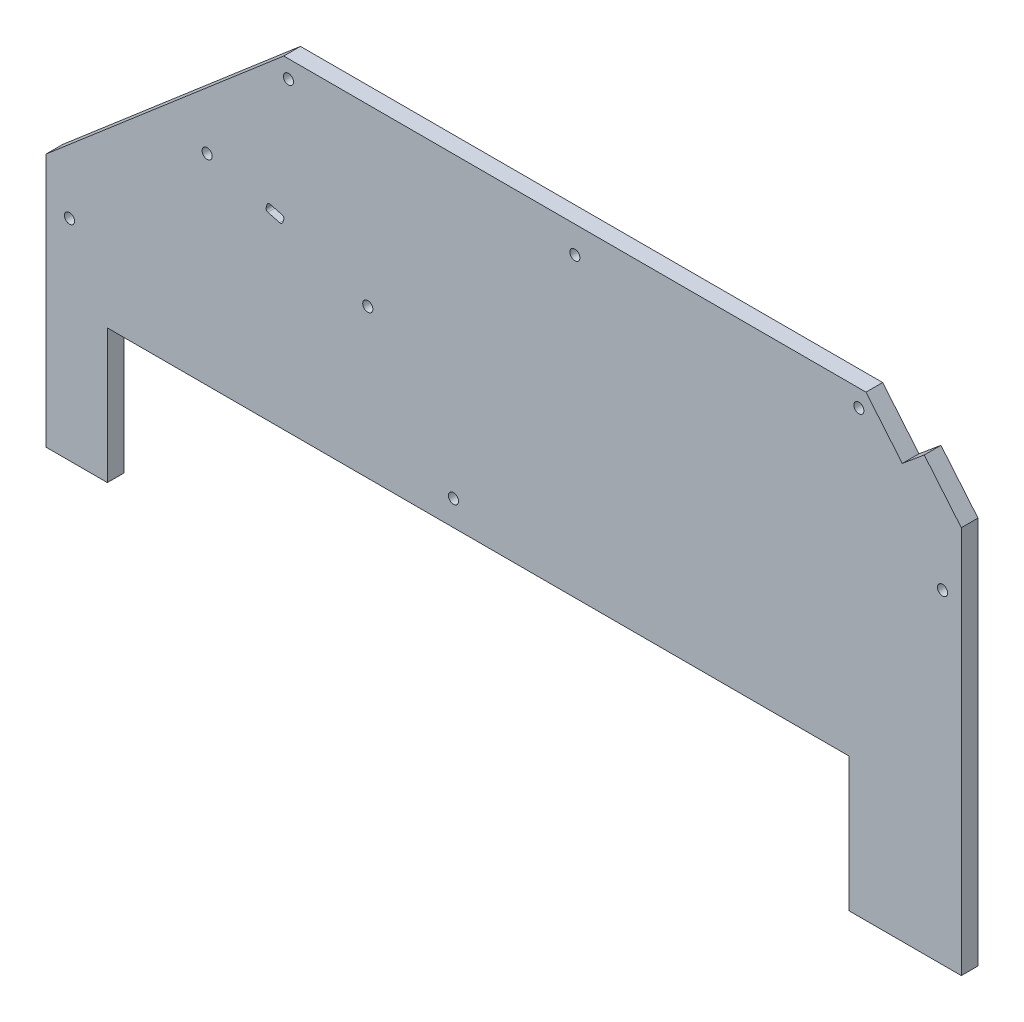
ISO-10303-21;
HEADER;
FILE_DESCRIPTION(('STEP AP214'),'2;1');
FILE_NAME('part.step','',(''),(''),'','','');
FILE_SCHEMA(('AUTOMOTIVE_DESIGN { 1 0 10303 214 1 1 1 1 }'));
ENDSEC;
DATA;
#1=APPLICATION_CONTEXT('core data for automotive mechanical design processes');
#2=APPLICATION_PROTOCOL_DEFINITION('international standard','automotive_design',2000,#1);
#3=PRODUCT_CONTEXT('',#1,'mechanical');
#4=PRODUCT('Part','Part','',(#3));
#5=PRODUCT_RELATED_PRODUCT_CATEGORY('part','',(#4));
#6=PRODUCT_DEFINITION_FORMATION('','',#4);
#7=PRODUCT_DEFINITION_CONTEXT('part definition',#1,'design');
#8=PRODUCT_DEFINITION('design','',#6,#7);
#9=PRODUCT_DEFINITION_SHAPE('','',#8);
#10=(LENGTH_UNIT() NAMED_UNIT(*) SI_UNIT(.MILLI.,.METRE.));
#11=(NAMED_UNIT(*) PLANE_ANGLE_UNIT() SI_UNIT($,.RADIAN.));
#12=(NAMED_UNIT(*) SI_UNIT($,.STERADIAN.) SOLID_ANGLE_UNIT());
#13=UNCERTAINTY_MEASURE_WITH_UNIT(LENGTH_MEASURE(1.E-05),#10,'distance_accuracy_value','');
#14=(GEOMETRIC_REPRESENTATION_CONTEXT(3) GLOBAL_UNCERTAINTY_ASSIGNED_CONTEXT((#13)) GLOBAL_UNIT_ASSIGNED_CONTEXT((#10,
#11,#12)) REPRESENTATION_CONTEXT('',''));
#15=CARTESIAN_POINT('',(0.,0.,0.));
#16=DIRECTION('',(0.,0.,1.));
#17=DIRECTION('',(1.,0.,0.));
#18=AXIS2_PLACEMENT_3D('',#15,#16,#17);
#19=CARTESIAN_POINT('',(2.27248775352962E-13,216.1,11.1125));
#20=DIRECTION('',(-0.768221279597372,-0.640184399664484,0.));
#21=DIRECTION('',(0.640184399664484,-0.768221279597372,0.));
#22=AXIS2_PLACEMENT_3D('',#19,#20,#21);
#23=PLANE('',#22);
#24=DIRECTION('',(0.,0.,1.));
#25=VECTOR('',#24,1.);
#26=CARTESIAN_POINT('',(-39.3145231764971,263.277427811796,0.));
#27=LINE('',#26,#25);
#28=CARTESIAN_POINT('',(-39.3145231764971,263.277427811796,0.));
#29=VERTEX_POINT('',#28);
#30=CARTESIAN_POINT('',(-39.3145231764971,263.277427811796,11.1125));
#31=VERTEX_POINT('',#30);
#32=EDGE_CURVE('E54',#29,#31,#27,.T.);
#33=ORIENTED_EDGE('',*,*,#32,.F.);
#34=DIRECTION('',(-0.640184399664484,0.768221279597372,0.));
#35=VECTOR('',#34,1.);
#36=CARTESIAN_POINT('',(2.27248775352962E-13,216.1,0.));
#37=LINE('',#36,#35);
#38=CARTESIAN_POINT('',(-63.4999999999995,292.299999999999,0.));
#39=VERTEX_POINT('',#38);
#40=EDGE_CURVE('E188',#29,#39,#37,.T.);
#41=ORIENTED_EDGE('',*,*,#40,.T.);
#42=DIRECTION('',(0.,0.,-1.));
#43=VECTOR('',#42,1.);
#44=CARTESIAN_POINT('',(-63.4999999999995,292.299999999999,11.1125));
#45=LINE('',#44,#43);
#46=CARTESIAN_POINT('',(-63.4999999999995,292.299999999999,11.1125));
#47=VERTEX_POINT('',#46);
#48=EDGE_CURVE('E357',#47,#39,#45,.T.);
#49=ORIENTED_EDGE('',*,*,#48,.F.);
#50=DIRECTION('',(-0.640184399664484,0.768221279597372,0.));
#51=VECTOR('',#50,1.);
#52=CARTESIAN_POINT('',(2.27248775352962E-13,216.1,11.1125));
#53=LINE('',#52,#51);
#54=EDGE_CURVE('E334',#31,#47,#53,.T.);
#55=ORIENTED_EDGE('',*,*,#54,.F.);
#56=EDGE_LOOP('',(#33,#41,#49,#55));
#57=FACE_BOUND('',#56,.T.);
#58=ADVANCED_FACE('F37',(#57),#23,.F.);
#59=CARTESIAN_POINT('',(0.,0.,11.1125));
#60=DIRECTION('',(0.,0.,1.));
#61=DIRECTION('',(1.,0.,0.));
#62=AXIS2_PLACEMENT_3D('',#59,#60,#61);
#63=PLANE('',#62);
#64=DIRECTION('',(0.,1.,0.));
#65=VECTOR('',#64,1.);
#66=CARTESIAN_POINT('',(-609.6,-12.5000000000001,11.1125));
#67=LINE('',#66,#65);
#68=CARTESIAN_POINT('',(-609.6,-12.5000000000001,11.1125));
#69=VERTEX_POINT('',#68);
#70=CARTESIAN_POINT('',(-609.6,156.571428571429,11.1125));
#71=VERTEX_POINT('',#70);
#72=EDGE_CURVE('E62',#69,#71,#67,.T.);
#73=ORIENTED_EDGE('',*,*,#72,.F.);
#74=DIRECTION('',(1.,0.,0.));
#75=VECTOR('',#74,1.);
#76=CARTESIAN_POINT('',(-629.05,-12.4999999999999,11.1125));
#77=LINE('',#76,#75);
#78=CARTESIAN_POINT('',(-568.725000000001,-12.4999999999999,11.1125));
#79=VERTEX_POINT('',#78);
#80=EDGE_CURVE('E321',#69,#79,#77,.T.);
#81=ORIENTED_EDGE('',*,*,#80,.T.);
#82=DIRECTION('',(0.,1.,0.));
#83=VECTOR('',#82,1.);
#84=CARTESIAN_POINT('',(-568.725000000001,-12.4999999999999,11.1125));
#85=LINE('',#84,#83);
#86=CARTESIAN_POINT('',(-568.725000000001,76.7620000000009,11.1125));
#87=VERTEX_POINT('',#86);
#88=EDGE_CURVE('E323',#79,#87,#85,.T.);
#89=ORIENTED_EDGE('',*,*,#88,.T.);
#90=DIRECTION('',(1.,0.,0.));
#91=VECTOR('',#90,1.);
#92=CARTESIAN_POINT('',(-568.725000000001,76.7620000000009,11.1125));
#93=LINE('',#92,#91);
#94=CARTESIAN_POINT('',(-74.8137000039997,76.7620000000009,11.1125));
#95=VERTEX_POINT('',#94);
#96=EDGE_CURVE('E326',#87,#95,#93,.T.);
#97=ORIENTED_EDGE('',*,*,#96,.T.);
#98=DIRECTION('',(0.,-1.,0.));
#99=VECTOR('',#98,1.);
#100=CARTESIAN_POINT('',(-74.8137000039997,-12.5,11.1125));
#101=LINE('',#100,#99);
#102=CARTESIAN_POINT('',(-74.8137000039997,-12.5,11.1125));
#103=VERTEX_POINT('',#102);
#104=EDGE_CURVE('E328',#95,#103,#101,.T.);
#105=ORIENTED_EDGE('',*,*,#104,.T.);
#106=DIRECTION('',(1.,0.,0.));
#107=VECTOR('',#106,1.);
#108=CARTESIAN_POINT('',(0.,-12.5,11.1125));
#109=LINE('',#108,#107);
#110=CARTESIAN_POINT('',(0.,-12.5,11.1125));
#111=VERTEX_POINT('',#110);
#112=EDGE_CURVE('E330',#103,#111,#109,.T.);
#113=ORIENTED_EDGE('',*,*,#112,.T.);
#114=DIRECTION('',(0.,1.,0.));
#115=VECTOR('',#114,1.);
#116=CARTESIAN_POINT('',(0.,-12.5,11.1125));
#117=LINE('',#116,#115);
#118=CARTESIAN_POINT('',(0.,245.857051265204,11.1125));
#119=VERTEX_POINT('',#118);
#120=EDGE_CURVE('E332',#111,#119,#117,.T.);
#121=ORIENTED_EDGE('',*,*,#120,.T.);
#122=DIRECTION('',(-0.640184399664486,0.768221279597371,0.));
#123=VECTOR('',#122,1.);
#124=CARTESIAN_POINT('',(0.,245.857051265204,11.1125));
#125=LINE('',#124,#123);
#126=CARTESIAN_POINT('',(-24.6799078001674,275.472940625405,11.1125));
#127=VERTEX_POINT('',#126);
#128=EDGE_CURVE('E197',#119,#127,#125,.T.);
#129=ORIENTED_EDGE('',*,*,#128,.T.);
#130=DIRECTION('',(-0.76822127959737,-0.640184399664487,0.));
#131=VECTOR('',#130,1.);
#132=CARTESIAN_POINT('',(-24.6799078001674,275.472940625405,11.1125));
#133=LINE('',#132,#131);
#134=EDGE_CURVE('E205',#127,#31,#133,.T.);
#135=ORIENTED_EDGE('',*,*,#134,.T.);
#136=ORIENTED_EDGE('',*,*,#54,.T.);
#137=DIRECTION('',(-1.,0.,0.));
#138=VECTOR('',#137,1.);
#139=CARTESIAN_POINT('',(-63.4999999999995,292.299999999999,11.1125));
#140=LINE('',#139,#138);
#141=CARTESIAN_POINT('',(-451.25,292.3,11.1125));
#142=VERTEX_POINT('',#141);
#143=EDGE_CURVE('E336',#47,#142,#140,.T.);
#144=ORIENTED_EDGE('',*,*,#143,.T.);
#145=DIRECTION('',(-0.759256602365297,-0.650791373455969,0.));
#146=VECTOR('',#145,1.);
#147=CARTESIAN_POINT('',(-451.25,292.3,11.1125));
#148=LINE('',#147,#146);
#149=EDGE_CURVE('E338',#142,#71,#148,.T.);
#150=ORIENTED_EDGE('',*,*,#149,.T.);
#151=EDGE_LOOP('',(#73,#81,#89,#97,#105,#113,#121,#129,#135,#136,#144,#150));
#152=FACE_BOUND('',#151,.T.);
#153=CARTESIAN_POINT('',(-502.262125610698,210.539469688394,11.1125));
#154=DIRECTION('',(0.,0.,1.));
#155=DIRECTION('',(1.,0.,0.));
#156=AXIS2_PLACEMENT_3D('',#153,#154,#155);
#157=CIRCLE('',#156,3.37819999999999);
#158=CARTESIAN_POINT('',(-498.883925610698,210.539469688394,11.1125));
#159=VERTEX_POINT('',#158);
#160=EDGE_CURVE('E237',#159,#159,#157,.T.);
#161=ORIENTED_EDGE('',*,*,#160,.F.);
#162=EDGE_LOOP('',(#161));
#163=FACE_BOUND('',#162,.T.);
#164=CARTESIAN_POINT('',(-338.209654284305,93.617887803001,11.1125));
#165=DIRECTION('',(0.,0.,1.));
#166=DIRECTION('',(1.,0.,0.));
#167=AXIS2_PLACEMENT_3D('',#164,#165,#166);
#168=CIRCLE('',#167,3.3782);
#169=CARTESIAN_POINT('',(-334.831454284305,93.617887803001,11.1125));
#170=VERTEX_POINT('',#169);
#171=EDGE_CURVE('E234',#170,#170,#168,.T.);
#172=ORIENTED_EDGE('',*,*,#171,.F.);
#173=EDGE_LOOP('',(#172));
#174=FACE_BOUND('',#173,.T.);
#175=CARTESIAN_POINT('',(-395.296950894929,175.84751254779,11.1125));
#176=DIRECTION('',(0.,0.,1.));
#177=DIRECTION('',(1.,0.,0.));
#178=AXIS2_PLACEMENT_3D('',#175,#176,#177);
#179=CIRCLE('',#178,3.37819999999999);
#180=CARTESIAN_POINT('',(-391.918750894929,175.84751254779,11.1125));
#181=VERTEX_POINT('',#180);
#182=EDGE_CURVE('E226',#181,#181,#179,.T.);
#183=ORIENTED_EDGE('',*,*,#182,.F.);
#184=EDGE_LOOP('',(#183));
#185=FACE_BOUND('',#184,.T.);
#186=CARTESIAN_POINT('',(-68.2333398844517,280.820108298407,11.1125));
#187=DIRECTION('',(0.,0.,-1.));
#188=DIRECTION('',(-1.,0.,0.));
#189=AXIS2_PLACEMENT_3D('',#186,#187,#188);
#190=CIRCLE('',#189,3.3655);
#191=CARTESIAN_POINT('',(-71.5988398844517,280.820108298407,11.1125));
#192=VERTEX_POINT('',#191);
#193=EDGE_CURVE('E240',#192,#192,#190,.T.);
#194=ORIENTED_EDGE('',*,*,#193,.T.);
#195=EDGE_LOOP('',(#194));
#196=FACE_BOUND('',#195,.T.);
#197=CARTESIAN_POINT('',(-257.375,274.519999999999,11.1125));
#198=DIRECTION('',(0.,0.,-1.));
#199=DIRECTION('',(-1.,0.,0.));
#200=AXIS2_PLACEMENT_3D('',#197,#198,#199);
#201=CIRCLE('',#200,3.36550000000002);
#202=CARTESIAN_POINT('',(-260.7405,274.519999999999,11.1125));
#203=VERTEX_POINT('',#202);
#204=EDGE_CURVE('E243',#203,#203,#201,.T.);
#205=ORIENTED_EDGE('',*,*,#204,.T.);
#206=EDGE_LOOP('',(#205));
#207=FACE_BOUND('',#206,.T.);
#208=CARTESIAN_POINT('',(-448.116254522585,280.517309604129,11.1125));
#209=DIRECTION('',(0.,0.,-1.));
#210=DIRECTION('',(-1.,0.,0.));
#211=AXIS2_PLACEMENT_3D('',#208,#209,#210);
#212=CIRCLE('',#211,3.36550000000002);
#213=CARTESIAN_POINT('',(-451.481754522585,280.517309604129,11.1125));
#214=VERTEX_POINT('',#213);
#215=EDGE_CURVE('E247',#214,#214,#212,.T.);
#216=ORIENTED_EDGE('',*,*,#215,.T.);
#217=EDGE_LOOP('',(#216));
#218=FACE_BOUND('',#217,.T.);
#219=CARTESIAN_POINT('',(-593.953382299921,127.327,11.1125));
#220=DIRECTION('',(0.,0.,-1.));
#221=DIRECTION('',(-1.,0.,0.));
#222=AXIS2_PLACEMENT_3D('',#219,#220,#221);
#223=CIRCLE('',#222,3.36550000000002);
#224=CARTESIAN_POINT('',(-597.318882299921,127.327,11.1125));
#225=VERTEX_POINT('',#224);
#226=EDGE_CURVE('E251',#225,#225,#223,.T.);
#227=ORIENTED_EDGE('',*,*,#226,.T.);
#228=EDGE_LOOP('',(#227));
#229=FACE_BOUND('',#228,.T.);
#230=DIRECTION('',(0.968277323709358,-0.249878019021769,0.));
#231=VECTOR('',#230,1.);
#232=CARTESIAN_POINT('',(-453.897256135812,194.80097797346,11.1125));
#233=LINE('',#232,#231);
#234=CARTESIAN_POINT('',(-461.832222689246,196.848711277572,11.1125));
#235=VERTEX_POINT('',#234);
#236=CARTESIAN_POINT('',(-453.897256135812,194.80097797346,11.1125));
#237=VERTEX_POINT('',#236);
#238=EDGE_CURVE('E264',#235,#237,#233,.T.);
#239=ORIENTED_EDGE('',*,*,#238,.F.);
#240=CARTESIAN_POINT('',(-461.435541334049,198.385851528961,11.1125));
#241=DIRECTION('',(0.,0.,1.));
#242=DIRECTION('',(1.,0.,0.));
#243=AXIS2_PLACEMENT_3D('',#240,#241,#242);
#244=CIRCLE('',#243,1.58750000000003);
#245=CARTESIAN_POINT('',(-462.972681585438,198.782532884158,11.1125));
#246=VERTEX_POINT('',#245);
#247=EDGE_CURVE('E262',#246,#235,#244,.T.);
#248=ORIENTED_EDGE('',*,*,#247,.F.);
#249=DIRECTION('',(-0.249878019021772,-0.968277323709357,0.));
#250=VECTOR('',#249,1.);
#251=CARTESIAN_POINT('',(-462.972681585438,198.782532884158,11.1125));
#252=LINE('',#251,#250);
#253=CARTESIAN_POINT('',(-462.362395197091,201.147392639004,11.1125));
#254=VERTEX_POINT('',#253);
#255=EDGE_CURVE('E278',#254,#246,#252,.T.);
#256=ORIENTED_EDGE('',*,*,#255,.F.);
#257=CARTESIAN_POINT('',(-460.825254945702,200.750711283807,11.1125));
#258=DIRECTION('',(0.,0.,1.));
#259=DIRECTION('',(-1.,0.,0.));
#260=AXIS2_PLACEMENT_3D('',#257,#258,#259);
#261=CIRCLE('',#260,1.5875);
#262=CARTESIAN_POINT('',(-460.428573590505,202.287851535196,11.1125));
#263=VERTEX_POINT('',#262);
#264=EDGE_CURVE('E275',#263,#254,#261,.T.);
#265=ORIENTED_EDGE('',*,*,#264,.F.);
#266=DIRECTION('',(-0.968277323709357,0.249878019021773,0.));
#267=VECTOR('',#266,1.);
#268=CARTESIAN_POINT('',(-460.428573590505,202.287851535196,11.1125));
#269=LINE('',#268,#267);
#270=CARTESIAN_POINT('',(-452.336342065125,200.199533722195,11.1125));
#271=VERTEX_POINT('',#270);
#272=EDGE_CURVE('E273',#271,#263,#269,.T.);
#273=ORIENTED_EDGE('',*,*,#272,.F.);
#274=CARTESIAN_POINT('',(-452.733023420322,198.662393470806,11.1125));
#275=DIRECTION('',(0.,0.,1.));
#276=DIRECTION('',(1.,0.,0.));
#277=AXIS2_PLACEMENT_3D('',#274,#275,#276);
#278=CIRCLE('',#277,1.58749999999995);
#279=CARTESIAN_POINT('',(-451.225592298544,198.164590635242,11.1125));
#280=VERTEX_POINT('',#279);
#281=EDGE_CURVE('E271',#280,#271,#278,.T.);
#282=ORIENTED_EDGE('',*,*,#281,.F.);
#283=DIRECTION('',(0.313576589331524,0.949562911356172,0.));
#284=VECTOR('',#283,1.);
#285=CARTESIAN_POINT('',(-451.225592298544,198.164590635242,11.1125));
#286=LINE('',#285,#284);
#287=CARTESIAN_POINT('',(-451.993143658837,195.840315389285,11.1125));
#288=VERTEX_POINT('',#287);
#289=EDGE_CURVE('E269',#288,#280,#286,.T.);
#290=ORIENTED_EDGE('',*,*,#289,.F.);
#291=CARTESIAN_POINT('',(-453.500574780615,196.338118224849,11.1125));
#292=DIRECTION('',(0.,0.,1.));
#293=DIRECTION('',(1.,0.,0.));
#294=AXIS2_PLACEMENT_3D('',#291,#292,#293);
#295=CIRCLE('',#294,1.58750000000008);
#296=EDGE_CURVE('E267',#237,#288,#295,.T.);
#297=ORIENTED_EDGE('',*,*,#296,.F.);
#298=EDGE_LOOP('',(#239,#248,#256,#265,#273,#282,#290,#297));
#299=FACE_BOUND('',#298,.T.);
#300=CARTESIAN_POINT('',(-12.4999999999996,203.6,11.1125));
#301=DIRECTION('',(0.,0.,1.));
#302=DIRECTION('',(1.,0.,0.));
#303=AXIS2_PLACEMENT_3D('',#300,#301,#302);
#304=CIRCLE('',#303,3.37820000000007);
#305=CARTESIAN_POINT('',(-9.12179999999955,203.6,11.1125));
#306=VERTEX_POINT('',#305);
#307=EDGE_CURVE('E255',#306,#306,#304,.T.);
#308=ORIENTED_EDGE('',*,*,#307,.F.);
#309=EDGE_LOOP('',(#308));
#310=FACE_BOUND('',#309,.T.);
#311=ADVANCED_FACE('F395',(#152,#163,#174,#185,#196,#207,#218,#229,#299,#310),#63,.T.);
#312=CARTESIAN_POINT('',(0.,0.,0.));
#313=DIRECTION('',(0.,0.,1.));
#314=DIRECTION('',(1.,0.,0.));
#315=AXIS2_PLACEMENT_3D('',#312,#313,#314);
#316=PLANE('',#315);
#317=CARTESIAN_POINT('',(-502.262125610698,210.539469688394,0.));
#318=DIRECTION('',(0.,0.,1.));
#319=DIRECTION('',(1.,0.,0.));
#320=AXIS2_PLACEMENT_3D('',#317,#318,#319);
#321=CIRCLE('',#320,3.37819999999999);
#322=CARTESIAN_POINT('',(-498.883925610698,210.539469688394,0.));
#323=VERTEX_POINT('',#322);
#324=EDGE_CURVE('E223',#323,#323,#321,.T.);
#325=ORIENTED_EDGE('',*,*,#324,.T.);
#326=EDGE_LOOP('',(#325));
#327=FACE_BOUND('',#326,.T.);
#328=CARTESIAN_POINT('',(-338.209654284305,93.617887803001,0.));
#329=DIRECTION('',(0.,0.,1.));
#330=DIRECTION('',(1.,0.,0.));
#331=AXIS2_PLACEMENT_3D('',#328,#329,#330);
#332=CIRCLE('',#331,3.3782);
#333=CARTESIAN_POINT('',(-334.831454284305,93.617887803001,0.));
#334=VERTEX_POINT('',#333);
#335=EDGE_CURVE('E227',#334,#334,#332,.T.);
#336=ORIENTED_EDGE('',*,*,#335,.T.);
#337=EDGE_LOOP('',(#336));
#338=FACE_BOUND('',#337,.T.);
#339=CARTESIAN_POINT('',(-395.296950894929,175.84751254779,0.));
#340=DIRECTION('',(0.,0.,1.));
#341=DIRECTION('',(1.,0.,0.));
#342=AXIS2_PLACEMENT_3D('',#339,#340,#341);
#343=CIRCLE('',#342,3.37819999999999);
#344=CARTESIAN_POINT('',(-391.918750894929,175.84751254779,0.));
#345=VERTEX_POINT('',#344);
#346=EDGE_CURVE('E221',#345,#345,#343,.T.);
#347=ORIENTED_EDGE('',*,*,#346,.T.);
#348=EDGE_LOOP('',(#347));
#349=FACE_BOUND('',#348,.T.);
#350=CARTESIAN_POINT('',(-68.2333398844517,280.820108298407,0.));
#351=DIRECTION('',(0.,0.,1.));
#352=DIRECTION('',(1.,0.,0.));
#353=AXIS2_PLACEMENT_3D('',#350,#351,#352);
#354=CIRCLE('',#353,3.3655);
#355=CARTESIAN_POINT('',(-64.8678398844517,280.820108298407,0.));
#356=VERTEX_POINT('',#355);
#357=EDGE_CURVE('E41',#356,#356,#354,.T.);
#358=ORIENTED_EDGE('',*,*,#357,.T.);
#359=EDGE_LOOP('',(#358));
#360=FACE_BOUND('',#359,.T.);
#361=CARTESIAN_POINT('',(-257.375,274.519999999999,0.));
#362=DIRECTION('',(0.,0.,1.));
#363=DIRECTION('',(1.,0.,0.));
#364=AXIS2_PLACEMENT_3D('',#361,#362,#363);
#365=CIRCLE('',#364,3.36550000000002);
#366=CARTESIAN_POINT('',(-254.0095,274.519999999999,0.));
#367=VERTEX_POINT('',#366);
#368=EDGE_CURVE('E246',#367,#367,#365,.T.);
#369=ORIENTED_EDGE('',*,*,#368,.T.);
#370=EDGE_LOOP('',(#369));
#371=FACE_BOUND('',#370,.T.);
#372=CARTESIAN_POINT('',(-448.116254522585,280.517309604129,0.));
#373=DIRECTION('',(0.,0.,1.));
#374=DIRECTION('',(1.,0.,0.));
#375=AXIS2_PLACEMENT_3D('',#372,#373,#374);
#376=CIRCLE('',#375,3.36550000000002);
#377=CARTESIAN_POINT('',(-444.750754522585,280.517309604129,0.));
#378=VERTEX_POINT('',#377);
#379=EDGE_CURVE('E250',#378,#378,#376,.T.);
#380=ORIENTED_EDGE('',*,*,#379,.T.);
#381=EDGE_LOOP('',(#380));
#382=FACE_BOUND('',#381,.T.);
#383=CARTESIAN_POINT('',(-593.953382299921,127.327,0.));
#384=DIRECTION('',(0.,0.,1.));
#385=DIRECTION('',(1.,0.,0.));
#386=AXIS2_PLACEMENT_3D('',#383,#384,#385);
#387=CIRCLE('',#386,3.36550000000002);
#388=CARTESIAN_POINT('',(-590.587882299921,127.327,0.));
#389=VERTEX_POINT('',#388);
#390=EDGE_CURVE('E254',#389,#389,#387,.T.);
#391=ORIENTED_EDGE('',*,*,#390,.T.);
#392=EDGE_LOOP('',(#391));
#393=FACE_BOUND('',#392,.T.);
#394=DIRECTION('',(1.,0.,0.));
#395=VECTOR('',#394,1.);
#396=CARTESIAN_POINT('',(-629.05,-12.4999999999999,0.));
#397=LINE('',#396,#395);
#398=CARTESIAN_POINT('',(-609.6,-12.5000000000001,0.));
#399=VERTEX_POINT('',#398);
#400=CARTESIAN_POINT('',(-568.725000000001,-12.4999999999999,0.));
#401=VERTEX_POINT('',#400);
#402=EDGE_CURVE('E320',#399,#401,#397,.T.);
#403=ORIENTED_EDGE('',*,*,#402,.F.);
#404=DIRECTION('',(0.,1.,0.));
#405=VECTOR('',#404,1.);
#406=CARTESIAN_POINT('',(-609.6,-12.5000000000001,0.));
#407=LINE('',#406,#405);
#408=CARTESIAN_POINT('',(-609.6,156.571428571429,0.));
#409=VERTEX_POINT('',#408);
#410=EDGE_CURVE('E214',#399,#409,#407,.T.);
#411=ORIENTED_EDGE('',*,*,#410,.T.);
#412=DIRECTION('',(-0.759256602365297,-0.650791373455969,0.));
#413=VECTOR('',#412,1.);
#414=CARTESIAN_POINT('',(-451.25,292.3,0.));
#415=LINE('',#414,#413);
#416=CARTESIAN_POINT('',(-451.25,292.3,0.));
#417=VERTEX_POINT('',#416);
#418=EDGE_CURVE('E324',#417,#409,#415,.T.);
#419=ORIENTED_EDGE('',*,*,#418,.F.);
#420=DIRECTION('',(-1.,0.,0.));
#421=VECTOR('',#420,1.);
#422=CARTESIAN_POINT('',(-63.4999999999995,292.299999999999,0.));
#423=LINE('',#422,#421);
#424=EDGE_CURVE('E351',#39,#417,#423,.T.);
#425=ORIENTED_EDGE('',*,*,#424,.F.);
#426=ORIENTED_EDGE('',*,*,#40,.F.);
#427=DIRECTION('',(-0.76822127959737,-0.640184399664487,0.));
#428=VECTOR('',#427,1.);
#429=CARTESIAN_POINT('',(-24.6799078001674,275.472940625405,0.));
#430=LINE('',#429,#428);
#431=CARTESIAN_POINT('',(-24.6799078001674,275.472940625405,0.));
#432=VERTEX_POINT('',#431);
#433=EDGE_CURVE('E199',#432,#29,#430,.T.);
#434=ORIENTED_EDGE('',*,*,#433,.F.);
#435=DIRECTION('',(-0.640184399664486,0.768221279597371,0.));
#436=VECTOR('',#435,1.);
#437=CARTESIAN_POINT('',(0.,245.857051265204,0.));
#438=LINE('',#437,#436);
#439=CARTESIAN_POINT('',(0.,245.857051265204,0.));
#440=VERTEX_POINT('',#439);
#441=EDGE_CURVE('E194',#440,#432,#438,.T.);
#442=ORIENTED_EDGE('',*,*,#441,.F.);
#443=DIRECTION('',(0.,1.,0.));
#444=VECTOR('',#443,1.);
#445=CARTESIAN_POINT('',(0.,-12.5,0.));
#446=LINE('',#445,#444);
#447=CARTESIAN_POINT('',(0.,-12.5,0.));
#448=VERTEX_POINT('',#447);
#449=EDGE_CURVE('E177',#448,#440,#446,.T.);
#450=ORIENTED_EDGE('',*,*,#449,.F.);
#451=DIRECTION('',(1.,0.,0.));
#452=VECTOR('',#451,1.);
#453=CARTESIAN_POINT('',(0.,-12.5,0.));
#454=LINE('',#453,#452);
#455=CARTESIAN_POINT('',(-74.8137000039997,-12.5,0.));
#456=VERTEX_POINT('',#455);
#457=EDGE_CURVE('E189',#456,#448,#454,.T.);
#458=ORIENTED_EDGE('',*,*,#457,.F.);
#459=DIRECTION('',(0.,-1.,0.));
#460=VECTOR('',#459,1.);
#461=CARTESIAN_POINT('',(-74.8137000039997,-12.5,0.));
#462=LINE('',#461,#460);
#463=CARTESIAN_POINT('',(-74.8137000039997,76.7620000000009,0.));
#464=VERTEX_POINT('',#463);
#465=EDGE_CURVE('E347',#464,#456,#462,.T.);
#466=ORIENTED_EDGE('',*,*,#465,.F.);
#467=DIRECTION('',(1.,0.,0.));
#468=VECTOR('',#467,1.);
#469=CARTESIAN_POINT('',(-568.725000000001,76.7620000000009,0.));
#470=LINE('',#469,#468);
#471=CARTESIAN_POINT('',(-568.725000000001,76.7620000000009,0.));
#472=VERTEX_POINT('',#471);
#473=EDGE_CURVE('E345',#472,#464,#470,.T.);
#474=ORIENTED_EDGE('',*,*,#473,.F.);
#475=DIRECTION('',(0.,1.,0.));
#476=VECTOR('',#475,1.);
#477=CARTESIAN_POINT('',(-568.725000000001,-12.4999999999999,0.));
#478=LINE('',#477,#476);
#479=EDGE_CURVE('E343',#401,#472,#478,.T.);
#480=ORIENTED_EDGE('',*,*,#479,.F.);
#481=EDGE_LOOP('',(#403,#411,#419,#425,#426,#434,#442,#450,#458,#466,#474,#480));
#482=FACE_BOUND('',#481,.T.);
#483=CARTESIAN_POINT('',(-461.435541334049,198.385851528961,0.));
#484=DIRECTION('',(0.,0.,1.));
#485=DIRECTION('',(1.,0.,0.));
#486=AXIS2_PLACEMENT_3D('',#483,#484,#485);
#487=CIRCLE('',#486,1.58750000000003);
#488=CARTESIAN_POINT('',(-462.972681585438,198.782532884158,0.));
#489=VERTEX_POINT('',#488);
#490=CARTESIAN_POINT('',(-461.832222689246,196.848711277572,0.));
#491=VERTEX_POINT('',#490);
#492=EDGE_CURVE('E258',#489,#491,#487,.T.);
#493=ORIENTED_EDGE('',*,*,#492,.T.);
#494=DIRECTION('',(0.968277323709358,-0.249878019021769,0.));
#495=VECTOR('',#494,1.);
#496=CARTESIAN_POINT('',(-453.897256135812,194.80097797346,0.));
#497=LINE('',#496,#495);
#498=CARTESIAN_POINT('',(-453.897256135812,194.80097797346,0.));
#499=VERTEX_POINT('',#498);
#500=EDGE_CURVE('E283',#491,#499,#497,.T.);
#501=ORIENTED_EDGE('',*,*,#500,.T.);
#502=CARTESIAN_POINT('',(-453.500574780615,196.338118224849,0.));
#503=DIRECTION('',(0.,0.,1.));
#504=DIRECTION('',(1.,0.,0.));
#505=AXIS2_PLACEMENT_3D('',#502,#503,#504);
#506=CIRCLE('',#505,1.58750000000008);
#507=CARTESIAN_POINT('',(-451.993143658837,195.840315389285,0.));
#508=VERTEX_POINT('',#507);
#509=EDGE_CURVE('E286',#499,#508,#506,.T.);
#510=ORIENTED_EDGE('',*,*,#509,.T.);
#511=DIRECTION('',(0.313576589331524,0.949562911356172,0.));
#512=VECTOR('',#511,1.);
#513=CARTESIAN_POINT('',(-451.225592298544,198.164590635242,0.));
#514=LINE('',#513,#512);
#515=CARTESIAN_POINT('',(-451.225592298544,198.164590635242,0.));
#516=VERTEX_POINT('',#515);
#517=EDGE_CURVE('E289',#508,#516,#514,.T.);
#518=ORIENTED_EDGE('',*,*,#517,.T.);
#519=CARTESIAN_POINT('',(-452.733023420322,198.662393470806,0.));
#520=DIRECTION('',(0.,0.,1.));
#521=DIRECTION('',(1.,0.,0.));
#522=AXIS2_PLACEMENT_3D('',#519,#520,#521);
#523=CIRCLE('',#522,1.58749999999995);
#524=CARTESIAN_POINT('',(-452.336342065125,200.199533722195,0.));
#525=VERTEX_POINT('',#524);
#526=EDGE_CURVE('E292',#516,#525,#523,.T.);
#527=ORIENTED_EDGE('',*,*,#526,.T.);
#528=DIRECTION('',(-0.968277323709357,0.249878019021773,0.));
#529=VECTOR('',#528,1.);
#530=CARTESIAN_POINT('',(-460.428573590505,202.287851535196,0.));
#531=LINE('',#530,#529);
#532=CARTESIAN_POINT('',(-460.428573590505,202.287851535196,0.));
#533=VERTEX_POINT('',#532);
#534=EDGE_CURVE('E295',#525,#533,#531,.T.);
#535=ORIENTED_EDGE('',*,*,#534,.T.);
#536=CARTESIAN_POINT('',(-460.825254945702,200.750711283807,0.));
#537=DIRECTION('',(0.,0.,1.));
#538=DIRECTION('',(-1.,0.,0.));
#539=AXIS2_PLACEMENT_3D('',#536,#537,#538);
#540=CIRCLE('',#539,1.5875);
#541=CARTESIAN_POINT('',(-462.36239519709,201.147392639004,0.));
#542=VERTEX_POINT('',#541);
#543=EDGE_CURVE('E298',#533,#542,#540,.T.);
#544=ORIENTED_EDGE('',*,*,#543,.T.);
#545=DIRECTION('',(-0.249878019021772,-0.968277323709357,0.));
#546=VECTOR('',#545,1.);
#547=CARTESIAN_POINT('',(-462.972681585438,198.782532884158,0.));
#548=LINE('',#547,#546);
#549=EDGE_CURVE('E265',#542,#489,#548,.T.);
#550=ORIENTED_EDGE('',*,*,#549,.T.);
#551=EDGE_LOOP('',(#493,#501,#510,#518,#527,#535,#544,#550));
#552=FACE_BOUND('',#551,.T.);
#553=CARTESIAN_POINT('',(-12.4999999999996,203.6,0.));
#554=DIRECTION('',(0.,0.,1.));
#555=DIRECTION('',(1.,0.,0.));
#556=AXIS2_PLACEMENT_3D('',#553,#554,#555);
#557=CIRCLE('',#556,3.37820000000007);
#558=CARTESIAN_POINT('',(-9.12179999999955,203.6,0.));
#559=VERTEX_POINT('',#558);
#560=EDGE_CURVE('E259',#559,#559,#557,.T.);
#561=ORIENTED_EDGE('',*,*,#560,.T.);
#562=EDGE_LOOP('',(#561));
#563=FACE_BOUND('',#562,.T.);
#564=ADVANCED_FACE('F202',(#327,#338,#349,#360,#371,#382,#393,#482,#552,#563),#316,.F.);
#565=CARTESIAN_POINT('',(-629.05,-12.4999999999999,11.1125));
#566=DIRECTION('',(0.,1.,0.));
#567=DIRECTION('',(-1.,0.,0.));
#568=AXIS2_PLACEMENT_3D('',#565,#566,#567);
#569=PLANE('',#568);
#570=ORIENTED_EDGE('',*,*,#80,.F.);
#571=DIRECTION('',(0.,0.,1.));
#572=VECTOR('',#571,1.);
#573=CARTESIAN_POINT('',(-609.6,-12.5000000000001,0.));
#574=LINE('',#573,#572);
#575=EDGE_CURVE('E217',#399,#69,#574,.T.);
#576=ORIENTED_EDGE('',*,*,#575,.F.);
#577=ORIENTED_EDGE('',*,*,#402,.T.);
#578=DIRECTION('',(0.,0.,-1.));
#579=VECTOR('',#578,1.);
#580=CARTESIAN_POINT('',(-568.725000000001,-12.4999999999999,11.1125));
#581=LINE('',#580,#579);
#582=EDGE_CURVE('E11',#79,#401,#581,.T.);
#583=ORIENTED_EDGE('',*,*,#582,.F.);
#584=EDGE_LOOP('',(#570,#576,#577,#583));
#585=FACE_BOUND('',#584,.T.);
#586=ADVANCED_FACE('F39',(#585),#569,.F.);
#587=CARTESIAN_POINT('',(-568.725000000001,-12.4999999999999,11.1125));
#588=DIRECTION('',(-1.,0.,0.));
#589=DIRECTION('',(0.,0.,1.));
#590=AXIS2_PLACEMENT_3D('',#587,#588,#589);
#591=PLANE('',#590);
#592=ORIENTED_EDGE('',*,*,#479,.T.);
#593=DIRECTION('',(0.,0.,-1.));
#594=VECTOR('',#593,1.);
#595=CARTESIAN_POINT('',(-568.725000000001,76.7620000000009,11.1125));
#596=LINE('',#595,#594);
#597=EDGE_CURVE('E46',#87,#472,#596,.T.);
#598=ORIENTED_EDGE('',*,*,#597,.F.);
#599=ORIENTED_EDGE('',*,*,#88,.F.);
#600=ORIENTED_EDGE('',*,*,#582,.T.);
#601=EDGE_LOOP('',(#592,#598,#599,#600));
#602=FACE_BOUND('',#601,.T.);
#603=ADVANCED_FACE('F418',(#602),#591,.F.);
#604=CARTESIAN_POINT('',(-568.725000000001,76.7620000000009,11.1125));
#605=DIRECTION('',(0.,1.,0.));
#606=DIRECTION('',(-1.,0.,0.));
#607=AXIS2_PLACEMENT_3D('',#604,#605,#606);
#608=PLANE('',#607);
#609=ORIENTED_EDGE('',*,*,#473,.T.);
#610=DIRECTION('',(0.,0.,-1.));
#611=VECTOR('',#610,1.);
#612=CARTESIAN_POINT('',(-74.8137000039997,76.7620000000009,11.1125));
#613=LINE('',#612,#611);
#614=EDGE_CURVE('E364',#95,#464,#613,.T.);
#615=ORIENTED_EDGE('',*,*,#614,.F.);
#616=ORIENTED_EDGE('',*,*,#96,.F.);
#617=ORIENTED_EDGE('',*,*,#597,.T.);
#618=EDGE_LOOP('',(#609,#615,#616,#617));
#619=FACE_BOUND('',#618,.T.);
#620=ADVANCED_FACE('F415',(#619),#608,.F.);
#621=CARTESIAN_POINT('',(-74.8137000039997,-12.5,11.1125));
#622=DIRECTION('',(1.,0.,0.));
#623=DIRECTION('',(0.,0.,-1.));
#624=AXIS2_PLACEMENT_3D('',#621,#622,#623);
#625=PLANE('',#624);
#626=ORIENTED_EDGE('',*,*,#465,.T.);
#627=DIRECTION('',(0.,0.,-1.));
#628=VECTOR('',#627,1.);
#629=CARTESIAN_POINT('',(-74.8137000039997,-12.5,11.1125));
#630=LINE('',#629,#628);
#631=EDGE_CURVE('E361',#103,#456,#630,.T.);
#632=ORIENTED_EDGE('',*,*,#631,.F.);
#633=ORIENTED_EDGE('',*,*,#104,.F.);
#634=ORIENTED_EDGE('',*,*,#614,.T.);
#635=EDGE_LOOP('',(#626,#632,#633,#634));
#636=FACE_BOUND('',#635,.T.);
#637=ADVANCED_FACE('F411',(#636),#625,.F.);
#638=CARTESIAN_POINT('',(0.,-12.5,11.1125));
#639=DIRECTION('',(0.,1.,0.));
#640=DIRECTION('',(-1.,0.,0.));
#641=AXIS2_PLACEMENT_3D('',#638,#639,#640);
#642=PLANE('',#641);
#643=ORIENTED_EDGE('',*,*,#457,.T.);
#644=DIRECTION('',(0.,0.,-1.));
#645=VECTOR('',#644,1.);
#646=CARTESIAN_POINT('',(0.,-12.5,11.1125));
#647=LINE('',#646,#645);
#648=EDGE_CURVE('E184',#111,#448,#647,.T.);
#649=ORIENTED_EDGE('',*,*,#648,.F.);
#650=ORIENTED_EDGE('',*,*,#112,.F.);
#651=ORIENTED_EDGE('',*,*,#631,.T.);
#652=EDGE_LOOP('',(#643,#649,#650,#651));
#653=FACE_BOUND('',#652,.T.);
#654=ADVANCED_FACE('F408',(#653),#642,.F.);
#655=CARTESIAN_POINT('',(0.,-12.5,11.1125));
#656=DIRECTION('',(-1.,0.,0.));
#657=DIRECTION('',(0.,-1.,0.));
#658=AXIS2_PLACEMENT_3D('',#655,#656,#657);
#659=PLANE('',#658);
#660=ORIENTED_EDGE('',*,*,#449,.T.);
#661=DIRECTION('',(0.,0.,1.));
#662=VECTOR('',#661,1.);
#663=CARTESIAN_POINT('',(0.,245.857051265204,0.));
#664=LINE('',#663,#662);
#665=EDGE_CURVE('E181',#440,#119,#664,.T.);
#666=ORIENTED_EDGE('',*,*,#665,.T.);
#667=ORIENTED_EDGE('',*,*,#120,.F.);
#668=ORIENTED_EDGE('',*,*,#648,.T.);
#669=EDGE_LOOP('',(#660,#666,#667,#668));
#670=FACE_BOUND('',#669,.T.);
#671=ADVANCED_FACE('F179',(#670),#659,.F.);
#672=CARTESIAN_POINT('',(-63.4999999999995,292.299999999999,11.1125));
#673=DIRECTION('',(0.,-1.,0.));
#674=DIRECTION('',(1.,0.,0.));
#675=AXIS2_PLACEMENT_3D('',#672,#673,#674);
#676=PLANE('',#675);
#677=ORIENTED_EDGE('',*,*,#424,.T.);
#678=DIRECTION('',(0.,0.,-1.));
#679=VECTOR('',#678,1.);
#680=CARTESIAN_POINT('',(-451.25,292.3,11.1125));
#681=LINE('',#680,#679);
#682=EDGE_CURVE('E341',#142,#417,#681,.T.);
#683=ORIENTED_EDGE('',*,*,#682,.F.);
#684=ORIENTED_EDGE('',*,*,#143,.F.);
#685=ORIENTED_EDGE('',*,*,#48,.T.);
#686=EDGE_LOOP('',(#677,#683,#684,#685));
#687=FACE_BOUND('',#686,.T.);
#688=ADVANCED_FACE('F404',(#687),#676,.F.);
#689=CARTESIAN_POINT('',(-451.25,292.3,11.1125));
#690=DIRECTION('',(0.650791373455968,-0.759256602365296,0.));
#691=DIRECTION('',(0.759256602365297,0.650791373455969,0.));
#692=AXIS2_PLACEMENT_3D('',#689,#690,#691);
#693=PLANE('',#692);
#694=ORIENTED_EDGE('',*,*,#418,.T.);
#695=DIRECTION('',(0.,0.,1.));
#696=VECTOR('',#695,1.);
#697=CARTESIAN_POINT('',(-609.6,156.571428571429,0.));
#698=LINE('',#697,#696);
#699=EDGE_CURVE('E219',#409,#71,#698,.T.);
#700=ORIENTED_EDGE('',*,*,#699,.T.);
#701=ORIENTED_EDGE('',*,*,#149,.F.);
#702=ORIENTED_EDGE('',*,*,#682,.T.);
#703=EDGE_LOOP('',(#694,#700,#701,#702));
#704=FACE_BOUND('',#703,.T.);
#705=ADVANCED_FACE('F443',(#704),#693,.F.);
#706=CARTESIAN_POINT('',(-461.435541334049,198.385851528961,11.1125));
#707=DIRECTION('',(0.,0.,-1.));
#708=DIRECTION('',(-1.,0.,0.));
#709=AXIS2_PLACEMENT_3D('',#706,#707,#708);
#710=CYLINDRICAL_SURFACE('',#709,1.58750000000003);
#711=ORIENTED_EDGE('',*,*,#492,.F.);
#712=DIRECTION('',(0.,0.,-1.));
#713=VECTOR('',#712,1.);
#714=CARTESIAN_POINT('',(-462.972681585438,198.782532884158,11.1125));
#715=LINE('',#714,#713);
#716=EDGE_CURVE('E280',#246,#489,#715,.T.);
#717=ORIENTED_EDGE('',*,*,#716,.F.);
#718=ORIENTED_EDGE('',*,*,#247,.T.);
#719=DIRECTION('',(0.,0.,-1.));
#720=VECTOR('',#719,1.);
#721=CARTESIAN_POINT('',(-461.832222689246,196.848711277572,11.1125));
#722=LINE('',#721,#720);
#723=EDGE_CURVE('E317',#235,#491,#722,.T.);
#724=ORIENTED_EDGE('',*,*,#723,.T.);
#725=EDGE_LOOP('',(#711,#717,#718,#724));
#726=FACE_BOUND('',#725,.T.);
#727=ADVANCED_FACE('F490',(#726),#710,.F.);
#728=CARTESIAN_POINT('',(-453.897256135812,194.80097797346,11.1125));
#729=DIRECTION('',(0.249878019021769,0.968277323709358,0.));
#730=DIRECTION('',(-0.968277323709358,0.249878019021769,0.));
#731=AXIS2_PLACEMENT_3D('',#728,#729,#730);
#732=PLANE('',#731);
#733=ORIENTED_EDGE('',*,*,#500,.F.);
#734=ORIENTED_EDGE('',*,*,#723,.F.);
#735=ORIENTED_EDGE('',*,*,#238,.T.);
#736=DIRECTION('',(0.,0.,-1.));
#737=VECTOR('',#736,1.);
#738=CARTESIAN_POINT('',(-453.897256135812,194.80097797346,11.1125));
#739=LINE('',#738,#737);
#740=EDGE_CURVE('E315',#237,#499,#739,.T.);
#741=ORIENTED_EDGE('',*,*,#740,.T.);
#742=EDGE_LOOP('',(#733,#734,#735,#741));
#743=FACE_BOUND('',#742,.T.);
#744=ADVANCED_FACE('F495',(#743),#732,.T.);
#745=CARTESIAN_POINT('',(-453.500574780615,196.338118224849,11.1125));
#746=DIRECTION('',(0.,0.,-1.));
#747=DIRECTION('',(-1.,0.,0.));
#748=AXIS2_PLACEMENT_3D('',#745,#746,#747);
#749=CYLINDRICAL_SURFACE('',#748,1.58750000000008);
#750=ORIENTED_EDGE('',*,*,#509,.F.);
#751=ORIENTED_EDGE('',*,*,#740,.F.);
#752=ORIENTED_EDGE('',*,*,#296,.T.);
#753=DIRECTION('',(0.,0.,-1.));
#754=VECTOR('',#753,1.);
#755=CARTESIAN_POINT('',(-451.993143658837,195.840315389285,11.1125));
#756=LINE('',#755,#754);
#757=EDGE_CURVE('E313',#288,#508,#756,.T.);
#758=ORIENTED_EDGE('',*,*,#757,.T.);
#759=EDGE_LOOP('',(#750,#751,#752,#758));
#760=FACE_BOUND('',#759,.T.);
#761=ADVANCED_FACE('F678',(#760),#749,.F.);
#762=CARTESIAN_POINT('',(-451.225592298544,198.164590635242,11.1125));
#763=DIRECTION('',(-0.949562911356172,0.313576589331524,0.));
#764=DIRECTION('',(-0.313576589331524,-0.949562911356172,0.));
#765=AXIS2_PLACEMENT_3D('',#762,#763,#764);
#766=PLANE('',#765);
#767=ORIENTED_EDGE('',*,*,#517,.F.);
#768=ORIENTED_EDGE('',*,*,#757,.F.);
#769=ORIENTED_EDGE('',*,*,#289,.T.);
#770=DIRECTION('',(0.,0.,-1.));
#771=VECTOR('',#770,1.);
#772=CARTESIAN_POINT('',(-451.225592298544,198.164590635242,11.1125));
#773=LINE('',#772,#771);
#774=EDGE_CURVE('E311',#280,#516,#773,.T.);
#775=ORIENTED_EDGE('',*,*,#774,.T.);
#776=EDGE_LOOP('',(#767,#768,#769,#775));
#777=FACE_BOUND('',#776,.T.);
#778=ADVANCED_FACE('F667',(#777),#766,.T.);
#779=CARTESIAN_POINT('',(-452.733023420322,198.662393470806,11.1125));
#780=DIRECTION('',(0.,0.,-1.));
#781=DIRECTION('',(-1.,0.,0.));
#782=AXIS2_PLACEMENT_3D('',#779,#780,#781);
#783=CYLINDRICAL_SURFACE('',#782,1.58749999999995);
#784=ORIENTED_EDGE('',*,*,#526,.F.);
#785=ORIENTED_EDGE('',*,*,#774,.F.);
#786=ORIENTED_EDGE('',*,*,#281,.T.);
#787=DIRECTION('',(0.,0.,-1.));
#788=VECTOR('',#787,1.);
#789=CARTESIAN_POINT('',(-452.336342065125,200.199533722195,11.1125));
#790=LINE('',#789,#788);
#791=EDGE_CURVE('E309',#271,#525,#790,.T.);
#792=ORIENTED_EDGE('',*,*,#791,.T.);
#793=EDGE_LOOP('',(#784,#785,#786,#792));
#794=FACE_BOUND('',#793,.T.);
#795=ADVANCED_FACE('F656',(#794),#783,.F.);
#796=CARTESIAN_POINT('',(-460.428573590505,202.287851535196,11.1125));
#797=DIRECTION('',(-0.249878019021773,-0.968277323709357,0.));
#798=DIRECTION('',(0.968277323709357,-0.249878019021773,0.));
#799=AXIS2_PLACEMENT_3D('',#796,#797,#798);
#800=PLANE('',#799);
#801=ORIENTED_EDGE('',*,*,#534,.F.);
#802=ORIENTED_EDGE('',*,*,#791,.F.);
#803=ORIENTED_EDGE('',*,*,#272,.T.);
#804=DIRECTION('',(0.,0.,-1.));
#805=VECTOR('',#804,1.);
#806=CARTESIAN_POINT('',(-460.428573590505,202.287851535196,11.1125));
#807=LINE('',#806,#805);
#808=EDGE_CURVE('E307',#263,#533,#807,.T.);
#809=ORIENTED_EDGE('',*,*,#808,.T.);
#810=EDGE_LOOP('',(#801,#802,#803,#809));
#811=FACE_BOUND('',#810,.T.);
#812=ADVANCED_FACE('F645',(#811),#800,.T.);
#813=CARTESIAN_POINT('',(-460.825254945702,200.750711283807,11.1125));
#814=DIRECTION('',(0.,0.,-1.));
#815=DIRECTION('',(-1.,0.,0.));
#816=AXIS2_PLACEMENT_3D('',#813,#814,#815);
#817=CYLINDRICAL_SURFACE('',#816,1.5875);
#818=ORIENTED_EDGE('',*,*,#543,.F.);
#819=ORIENTED_EDGE('',*,*,#808,.F.);
#820=ORIENTED_EDGE('',*,*,#264,.T.);
#821=DIRECTION('',(0.,0.,-1.));
#822=VECTOR('',#821,1.);
#823=CARTESIAN_POINT('',(-462.36239519709,201.147392639004,11.1125));
#824=LINE('',#823,#822);
#825=EDGE_CURVE('E305',#254,#542,#824,.T.);
#826=ORIENTED_EDGE('',*,*,#825,.T.);
#827=EDGE_LOOP('',(#818,#819,#820,#826));
#828=FACE_BOUND('',#827,.T.);
#829=ADVANCED_FACE('F634',(#828),#817,.F.);
#830=CARTESIAN_POINT('',(-462.972681585438,198.782532884158,11.1125));
#831=DIRECTION('',(0.968277323709357,-0.249878019021772,0.));
#832=DIRECTION('',(0.249878019021772,0.968277323709357,0.));
#833=AXIS2_PLACEMENT_3D('',#830,#831,#832);
#834=PLANE('',#833);
#835=ORIENTED_EDGE('',*,*,#549,.F.);
#836=ORIENTED_EDGE('',*,*,#825,.F.);
#837=ORIENTED_EDGE('',*,*,#255,.T.);
#838=ORIENTED_EDGE('',*,*,#716,.T.);
#839=EDGE_LOOP('',(#835,#836,#837,#838));
#840=FACE_BOUND('',#839,.T.);
#841=ADVANCED_FACE('F623',(#840),#834,.T.);
#842=CARTESIAN_POINT('',(-12.4999999999996,203.6,11.1125));
#843=DIRECTION('',(0.,0.,-1.));
#844=DIRECTION('',(-1.,0.,0.));
#845=AXIS2_PLACEMENT_3D('',#842,#843,#844);
#846=CYLINDRICAL_SURFACE('',#845,3.37820000000007);
#847=ORIENTED_EDGE('',*,*,#307,.T.);
#848=EDGE_LOOP('',(#847));
#849=FACE_BOUND('',#848,.T.);
#850=ORIENTED_EDGE('',*,*,#560,.F.);
#851=EDGE_LOOP('',(#850));
#852=FACE_BOUND('',#851,.T.);
#853=ADVANCED_FACE('F612',(#849,#852),#846,.F.);
#854=CARTESIAN_POINT('',(-593.953382299921,127.327,11.1125));
#855=DIRECTION('',(0.,0.,-1.));
#856=DIRECTION('',(-1.,0.,0.));
#857=AXIS2_PLACEMENT_3D('',#854,#855,#856);
#858=CYLINDRICAL_SURFACE('',#857,3.36550000000002);
#859=ORIENTED_EDGE('',*,*,#226,.F.);
#860=EDGE_LOOP('',(#859));
#861=FACE_BOUND('',#860,.T.);
#862=ORIENTED_EDGE('',*,*,#390,.F.);
#863=EDGE_LOOP('',(#862));
#864=FACE_BOUND('',#863,.T.);
#865=ADVANCED_FACE('F390',(#861,#864),#858,.F.);
#866=CARTESIAN_POINT('',(-448.116254522585,280.517309604129,11.1125));
#867=DIRECTION('',(0.,0.,-1.));
#868=DIRECTION('',(-1.,0.,0.));
#869=AXIS2_PLACEMENT_3D('',#866,#867,#868);
#870=CYLINDRICAL_SURFACE('',#869,3.36550000000002);
#871=ORIENTED_EDGE('',*,*,#215,.F.);
#872=EDGE_LOOP('',(#871));
#873=FACE_BOUND('',#872,.T.);
#874=ORIENTED_EDGE('',*,*,#379,.F.);
#875=EDGE_LOOP('',(#874));
#876=FACE_BOUND('',#875,.T.);
#877=ADVANCED_FACE('F380',(#873,#876),#870,.F.);
#878=CARTESIAN_POINT('',(-257.375,274.519999999999,11.1125));
#879=DIRECTION('',(0.,0.,-1.));
#880=DIRECTION('',(-1.,0.,0.));
#881=AXIS2_PLACEMENT_3D('',#878,#879,#880);
#882=CYLINDRICAL_SURFACE('',#881,3.36550000000002);
#883=ORIENTED_EDGE('',*,*,#204,.F.);
#884=EDGE_LOOP('',(#883));
#885=FACE_BOUND('',#884,.T.);
#886=ORIENTED_EDGE('',*,*,#368,.F.);
#887=EDGE_LOOP('',(#886));
#888=FACE_BOUND('',#887,.T.);
#889=ADVANCED_FACE('F377',(#885,#888),#882,.F.);
#890=CARTESIAN_POINT('',(-68.2333398844517,280.820108298407,11.1125));
#891=DIRECTION('',(0.,0.,-1.));
#892=DIRECTION('',(-1.,0.,0.));
#893=AXIS2_PLACEMENT_3D('',#890,#891,#892);
#894=CYLINDRICAL_SURFACE('',#893,3.3655);
#895=ORIENTED_EDGE('',*,*,#193,.F.);
#896=EDGE_LOOP('',(#895));
#897=FACE_BOUND('',#896,.T.);
#898=ORIENTED_EDGE('',*,*,#357,.F.);
#899=EDGE_LOOP('',(#898));
#900=FACE_BOUND('',#899,.T.);
#901=ADVANCED_FACE('F379',(#897,#900),#894,.F.);
#902=CARTESIAN_POINT('',(-395.296950894929,175.84751254779,0.));
#903=DIRECTION('',(0.,0.,1.));
#904=DIRECTION('',(1.,0.,0.));
#905=AXIS2_PLACEMENT_3D('',#902,#903,#904);
#906=CYLINDRICAL_SURFACE('',#905,3.37819999999999);
#907=ORIENTED_EDGE('',*,*,#182,.T.);
#908=EDGE_LOOP('',(#907));
#909=FACE_BOUND('',#908,.T.);
#910=ORIENTED_EDGE('',*,*,#346,.F.);
#911=EDGE_LOOP('',(#910));
#912=FACE_BOUND('',#911,.T.);
#913=ADVANCED_FACE('F387',(#909,#912),#906,.F.);
#914=CARTESIAN_POINT('',(-338.209654284305,93.617887803001,0.));
#915=DIRECTION('',(0.,0.,1.));
#916=DIRECTION('',(1.,0.,0.));
#917=AXIS2_PLACEMENT_3D('',#914,#915,#916);
#918=CYLINDRICAL_SURFACE('',#917,3.3782);
#919=ORIENTED_EDGE('',*,*,#171,.T.);
#920=EDGE_LOOP('',(#919));
#921=FACE_BOUND('',#920,.T.);
#922=ORIENTED_EDGE('',*,*,#335,.F.);
#923=EDGE_LOOP('',(#922));
#924=FACE_BOUND('',#923,.T.);
#925=ADVANCED_FACE('F465',(#921,#924),#918,.F.);
#926=CARTESIAN_POINT('',(-502.262125610698,210.539469688394,0.));
#927=DIRECTION('',(0.,0.,1.));
#928=DIRECTION('',(1.,0.,0.));
#929=AXIS2_PLACEMENT_3D('',#926,#927,#928);
#930=CYLINDRICAL_SURFACE('',#929,3.37819999999999);
#931=ORIENTED_EDGE('',*,*,#160,.T.);
#932=EDGE_LOOP('',(#931));
#933=FACE_BOUND('',#932,.T.);
#934=ORIENTED_EDGE('',*,*,#324,.F.);
#935=EDGE_LOOP('',(#934));
#936=FACE_BOUND('',#935,.T.);
#937=ADVANCED_FACE('F460',(#933,#936),#930,.F.);
#938=CARTESIAN_POINT('',(-609.6,-12.5000000000001,0.));
#939=DIRECTION('',(1.,0.,0.));
#940=DIRECTION('',(0.,0.,-1.));
#941=AXIS2_PLACEMENT_3D('',#938,#939,#940);
#942=PLANE('',#941);
#943=ORIENTED_EDGE('',*,*,#72,.T.);
#944=ORIENTED_EDGE('',*,*,#699,.F.);
#945=ORIENTED_EDGE('',*,*,#410,.F.);
#946=ORIENTED_EDGE('',*,*,#575,.T.);
#947=EDGE_LOOP('',(#943,#944,#945,#946));
#948=FACE_BOUND('',#947,.T.);
#949=ADVANCED_FACE('F453',(#948),#942,.F.);
#950=CARTESIAN_POINT('',(-24.6799078001674,275.472940625405,0.));
#951=DIRECTION('',(-0.640184399664487,0.76822127959737,0.));
#952=DIRECTION('',(-0.76822127959737,-0.640184399664487,0.));
#953=AXIS2_PLACEMENT_3D('',#950,#951,#952);
#954=PLANE('',#953);
#955=ORIENTED_EDGE('',*,*,#134,.F.);
#956=DIRECTION('',(0.,0.,1.));
#957=VECTOR('',#956,1.);
#958=CARTESIAN_POINT('',(-24.6799078001674,275.472940625405,0.));
#959=LINE('',#958,#957);
#960=EDGE_CURVE('E198',#432,#127,#959,.T.);
#961=ORIENTED_EDGE('',*,*,#960,.F.);
#962=ORIENTED_EDGE('',*,*,#433,.T.);
#963=ORIENTED_EDGE('',*,*,#32,.T.);
#964=EDGE_LOOP('',(#955,#961,#962,#963));
#965=FACE_BOUND('',#964,.T.);
#966=ADVANCED_FACE('F451',(#965),#954,.T.);
#967=CARTESIAN_POINT('',(0.,245.857051265204,0.));
#968=DIRECTION('',(0.76822127959737,0.640184399664486,0.));
#969=DIRECTION('',(-0.640184399664486,0.768221279597371,0.));
#970=AXIS2_PLACEMENT_3D('',#967,#968,#969);
#971=PLANE('',#970);
#972=ORIENTED_EDGE('',*,*,#128,.F.);
#973=ORIENTED_EDGE('',*,*,#665,.F.);
#974=ORIENTED_EDGE('',*,*,#441,.T.);
#975=ORIENTED_EDGE('',*,*,#960,.T.);
#976=EDGE_LOOP('',(#972,#973,#974,#975));
#977=FACE_BOUND('',#976,.T.);
#978=ADVANCED_FACE('F193',(#977),#971,.T.);
#979=CLOSED_SHELL('',(#58,#311,#564,#586,#603,#620,#637,#654,#671,#688,#705,#727,#744,#761,#778,
#795,#812,#829,#841,#853,#865,#877,#889,#901,#913,#925,#937,#949,#966,#978));
#980=MANIFOLD_SOLID_BREP('B2',#979);
#981=ADVANCED_BREP_SHAPE_REPRESENTATION('',(#18,#980),#14);
#982=SHAPE_DEFINITION_REPRESENTATION(#9,#981);
ENDSEC;
END-ISO-10303-21;
